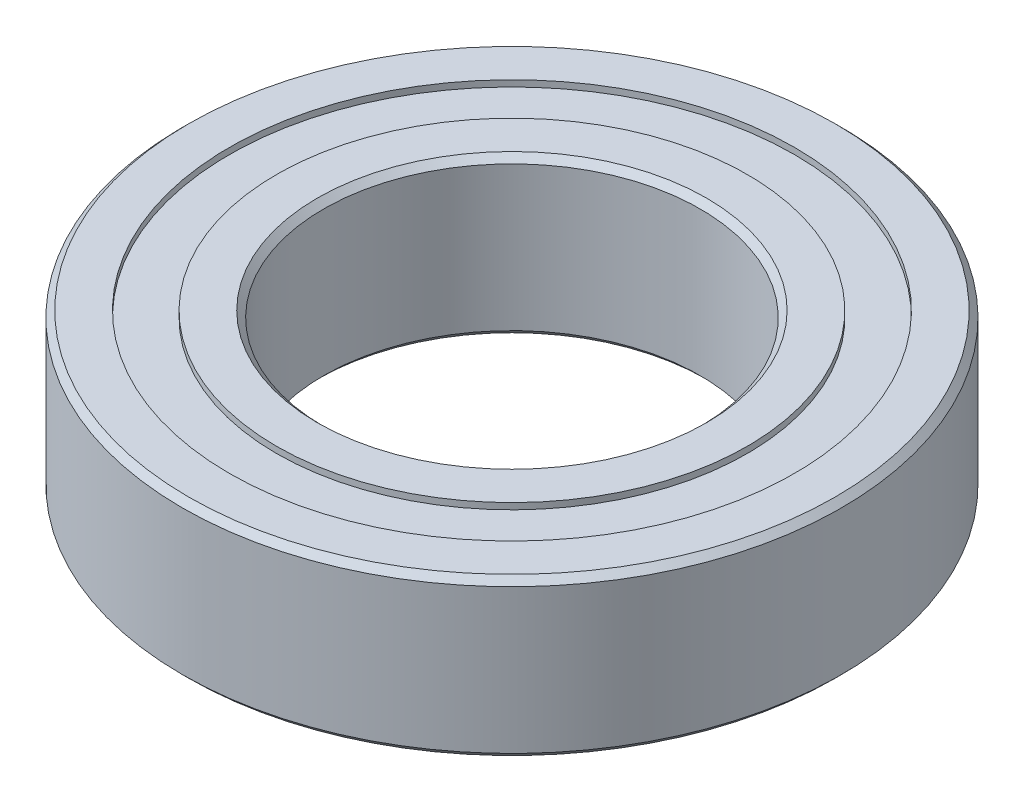
ISO-10303-21;
HEADER;
FILE_DESCRIPTION(('STEP AP214'),'2;1');
FILE_NAME('part.step','',(''),(''),'','','');
FILE_SCHEMA(('AUTOMOTIVE_DESIGN { 1 0 10303 214 1 1 1 1 }'));
ENDSEC;
DATA;
#1=APPLICATION_CONTEXT('core data for automotive mechanical design processes');
#2=APPLICATION_PROTOCOL_DEFINITION('international standard','automotive_design',2000,#1);
#3=PRODUCT_CONTEXT('',#1,'mechanical');
#4=PRODUCT('Part','Part','',(#3));
#5=PRODUCT_RELATED_PRODUCT_CATEGORY('part','',(#4));
#6=PRODUCT_DEFINITION_FORMATION('','',#4);
#7=PRODUCT_DEFINITION_CONTEXT('part definition',#1,'design');
#8=PRODUCT_DEFINITION('design','',#6,#7);
#9=PRODUCT_DEFINITION_SHAPE('','',#8);
#10=(LENGTH_UNIT() NAMED_UNIT(*) SI_UNIT(.MILLI.,.METRE.));
#11=(NAMED_UNIT(*) PLANE_ANGLE_UNIT() SI_UNIT($,.RADIAN.));
#12=(NAMED_UNIT(*) SI_UNIT($,.STERADIAN.) SOLID_ANGLE_UNIT());
#13=UNCERTAINTY_MEASURE_WITH_UNIT(LENGTH_MEASURE(1.E-05),#10,'distance_accuracy_value','');
#14=(GEOMETRIC_REPRESENTATION_CONTEXT(3) GLOBAL_UNCERTAINTY_ASSIGNED_CONTEXT((#13)) GLOBAL_UNIT_ASSIGNED_CONTEXT((#10,
#11,#12)) REPRESENTATION_CONTEXT('',''));
#15=CARTESIAN_POINT('',(0.,0.,0.));
#16=DIRECTION('',(0.,0.,1.));
#17=DIRECTION('',(1.,0.,0.));
#18=AXIS2_PLACEMENT_3D('',#15,#16,#17);
#19=CARTESIAN_POINT('',(0.,0.,0.));
#20=DIRECTION('',(0.,-1.,0.));
#21=DIRECTION('',(0.,0.,-1.));
#22=AXIS2_PLACEMENT_3D('',#19,#20,#21);
#23=CONICAL_SURFACE('',#22,6.2,0.785398163397444);
#24=CARTESIAN_POINT('',(0.,0.199999999999996,0.));
#25=DIRECTION('',(0.,-1.,0.));
#26=DIRECTION('',(0.,0.,1.));
#27=AXIS2_PLACEMENT_3D('',#24,#25,#26);
#28=CIRCLE('',#27,6.);
#29=CARTESIAN_POINT('',(0.,0.199999999999996,6.));
#30=VERTEX_POINT('',#29);
#31=EDGE_CURVE('E28',#30,#30,#28,.T.);
#32=ORIENTED_EDGE('',*,*,#31,.F.);
#33=EDGE_LOOP('',(#32));
#34=FACE_BOUND('',#33,.T.);
#35=CARTESIAN_POINT('',(0.,0.,0.));
#36=DIRECTION('',(0.,1.,0.));
#37=DIRECTION('',(0.,0.,1.));
#38=AXIS2_PLACEMENT_3D('',#35,#36,#37);
#39=CIRCLE('',#38,6.2);
#40=CARTESIAN_POINT('',(0.,0.,6.2));
#41=VERTEX_POINT('',#40);
#42=EDGE_CURVE('E54',#41,#41,#39,.T.);
#43=ORIENTED_EDGE('',*,*,#42,.F.);
#44=EDGE_LOOP('',(#43));
#45=FACE_BOUND('',#44,.T.);
#46=ADVANCED_FACE('F17',(#34,#45),#23,.F.);
#47=CARTESIAN_POINT('',(0.,4.8,0.));
#48=DIRECTION('',(0.,1.,0.));
#49=DIRECTION('',(0.,0.,1.));
#50=AXIS2_PLACEMENT_3D('',#47,#48,#49);
#51=CONICAL_SURFACE('',#50,6.,0.785398163397452);
#52=CARTESIAN_POINT('',(0.,4.8,0.));
#53=DIRECTION('',(0.,1.,0.));
#54=DIRECTION('',(0.,0.,1.));
#55=AXIS2_PLACEMENT_3D('',#52,#53,#54);
#56=CIRCLE('',#55,6.);
#57=CARTESIAN_POINT('',(0.,4.8,6.));
#58=VERTEX_POINT('',#57);
#59=EDGE_CURVE('E11',#58,#58,#56,.T.);
#60=ORIENTED_EDGE('',*,*,#59,.F.);
#61=EDGE_LOOP('',(#60));
#62=FACE_BOUND('',#61,.T.);
#63=CARTESIAN_POINT('',(0.,5.,0.));
#64=DIRECTION('',(0.,-1.,0.));
#65=DIRECTION('',(0.,0.,1.));
#66=AXIS2_PLACEMENT_3D('',#63,#64,#65);
#67=CIRCLE('',#66,6.2);
#68=CARTESIAN_POINT('',(0.,5.,6.2));
#69=VERTEX_POINT('',#68);
#70=EDGE_CURVE('E21',#69,#69,#67,.T.);
#71=ORIENTED_EDGE('',*,*,#70,.F.);
#72=EDGE_LOOP('',(#71));
#73=FACE_BOUND('',#72,.T.);
#74=ADVANCED_FACE('F167',(#62,#73),#51,.F.);
#75=CARTESIAN_POINT('',(0.,0.199999999999997,0.));
#76=DIRECTION('',(0.,1.,0.));
#77=DIRECTION('',(0.,0.,1.));
#78=AXIS2_PLACEMENT_3D('',#75,#76,#77);
#79=CONICAL_SURFACE('',#78,10.5,0.785398163397452);
#80=CARTESIAN_POINT('',(0.,0.,0.));
#81=DIRECTION('',(0.,-1.,0.));
#82=DIRECTION('',(0.,0.,1.));
#83=AXIS2_PLACEMENT_3D('',#80,#81,#82);
#84=CIRCLE('',#83,10.3);
#85=CARTESIAN_POINT('',(0.,0.,10.3));
#86=VERTEX_POINT('',#85);
#87=EDGE_CURVE('E135',#86,#86,#84,.T.);
#88=ORIENTED_EDGE('',*,*,#87,.F.);
#89=EDGE_LOOP('',(#88));
#90=FACE_BOUND('',#89,.T.);
#91=CARTESIAN_POINT('',(0.,0.199999999999997,0.));
#92=DIRECTION('',(0.,1.,0.));
#93=DIRECTION('',(0.,0.,1.));
#94=AXIS2_PLACEMENT_3D('',#91,#92,#93);
#95=CIRCLE('',#94,10.5);
#96=CARTESIAN_POINT('',(0.,0.199999999999997,10.5));
#97=VERTEX_POINT('',#96);
#98=EDGE_CURVE('E108',#97,#97,#95,.T.);
#99=ORIENTED_EDGE('',*,*,#98,.F.);
#100=EDGE_LOOP('',(#99));
#101=FACE_BOUND('',#100,.T.);
#102=ADVANCED_FACE('F169',(#90,#101),#79,.T.);
#103=CARTESIAN_POINT('',(0.,5.,0.));
#104=DIRECTION('',(0.,-1.,0.));
#105=DIRECTION('',(0.,0.,-1.));
#106=AXIS2_PLACEMENT_3D('',#103,#104,#105);
#107=CONICAL_SURFACE('',#106,10.3,0.785398163397448);
#108=CARTESIAN_POINT('',(0.,5.,0.));
#109=DIRECTION('',(0.,1.,0.));
#110=DIRECTION('',(0.,0.,1.));
#111=AXIS2_PLACEMENT_3D('',#108,#109,#110);
#112=CIRCLE('',#111,10.3);
#113=CARTESIAN_POINT('',(0.,5.,10.3));
#114=VERTEX_POINT('',#113);
#115=EDGE_CURVE('E125',#114,#114,#112,.T.);
#116=ORIENTED_EDGE('',*,*,#115,.F.);
#117=EDGE_LOOP('',(#116));
#118=FACE_BOUND('',#117,.T.);
#119=CARTESIAN_POINT('',(0.,4.8,0.));
#120=DIRECTION('',(0.,-1.,0.));
#121=DIRECTION('',(0.,0.,1.));
#122=AXIS2_PLACEMENT_3D('',#119,#120,#121);
#123=CIRCLE('',#122,10.5);
#124=CARTESIAN_POINT('',(0.,4.8,10.5));
#125=VERTEX_POINT('',#124);
#126=EDGE_CURVE('E103',#125,#125,#123,.T.);
#127=ORIENTED_EDGE('',*,*,#126,.F.);
#128=EDGE_LOOP('',(#127));
#129=FACE_BOUND('',#128,.T.);
#130=ADVANCED_FACE('F176',(#118,#129),#107,.T.);
#131=CARTESIAN_POINT('',(0.,4.8,0.));
#132=DIRECTION('',(0.,1.,0.));
#133=DIRECTION('',(0.,0.,1.));
#134=AXIS2_PLACEMENT_3D('',#131,#132,#133);
#135=CYLINDRICAL_SURFACE('',#134,7.5);
#136=CARTESIAN_POINT('',(0.,0.2,0.));
#137=DIRECTION('',(0.,-1.,0.));
#138=DIRECTION('',(0.,0.,-1.));
#139=AXIS2_PLACEMENT_3D('',#136,#137,#138);
#140=CIRCLE('',#139,7.5);
#141=CARTESIAN_POINT('',(0.,0.2,-7.5));
#142=VERTEX_POINT('',#141);
#143=EDGE_CURVE('E124',#142,#142,#140,.T.);
#144=ORIENTED_EDGE('',*,*,#143,.T.);
#145=EDGE_LOOP('',(#144));
#146=FACE_BOUND('',#145,.T.);
#147=CARTESIAN_POINT('',(0.,0.,0.));
#148=DIRECTION('',(0.,-1.,0.));
#149=DIRECTION('',(0.,0.,1.));
#150=AXIS2_PLACEMENT_3D('',#147,#148,#149);
#151=CIRCLE('',#150,7.5);
#152=CARTESIAN_POINT('',(0.,0.,7.5));
#153=VERTEX_POINT('',#152);
#154=EDGE_CURVE('E67',#153,#153,#151,.T.);
#155=ORIENTED_EDGE('',*,*,#154,.F.);
#156=EDGE_LOOP('',(#155));
#157=FACE_BOUND('',#156,.T.);
#158=ADVANCED_FACE('F191',(#146,#157),#135,.T.);
#159=CARTESIAN_POINT('',(0.,4.8,0.));
#160=DIRECTION('',(0.,1.,0.));
#161=DIRECTION('',(0.,0.,1.));
#162=AXIS2_PLACEMENT_3D('',#159,#160,#161);
#163=CYLINDRICAL_SURFACE('',#162,9.);
#164=CARTESIAN_POINT('',(0.,0.2,0.));
#165=DIRECTION('',(0.,-1.,0.));
#166=DIRECTION('',(0.,0.,-1.));
#167=AXIS2_PLACEMENT_3D('',#164,#165,#166);
#168=CIRCLE('',#167,9.);
#169=CARTESIAN_POINT('',(0.,0.2,-9.));
#170=VERTEX_POINT('',#169);
#171=EDGE_CURVE('E121',#170,#170,#168,.T.);
#172=ORIENTED_EDGE('',*,*,#171,.F.);
#173=EDGE_LOOP('',(#172));
#174=FACE_BOUND('',#173,.T.);
#175=CARTESIAN_POINT('',(0.,0.,0.));
#176=DIRECTION('',(0.,-1.,0.));
#177=DIRECTION('',(0.,0.,1.));
#178=AXIS2_PLACEMENT_3D('',#175,#176,#177);
#179=CIRCLE('',#178,9.);
#180=CARTESIAN_POINT('',(0.,0.,9.));
#181=VERTEX_POINT('',#180);
#182=EDGE_CURVE('E133',#181,#181,#179,.T.);
#183=ORIENTED_EDGE('',*,*,#182,.T.);
#184=EDGE_LOOP('',(#183));
#185=FACE_BOUND('',#184,.T.);
#186=ADVANCED_FACE('F188',(#174,#185),#163,.F.);
#187=CARTESIAN_POINT('',(0.,4.8,0.));
#188=DIRECTION('',(0.,1.,0.));
#189=DIRECTION('',(0.,0.,1.));
#190=AXIS2_PLACEMENT_3D('',#187,#188,#189);
#191=CYLINDRICAL_SURFACE('',#190,7.5);
#192=CARTESIAN_POINT('',(0.,4.8,0.));
#193=DIRECTION('',(0.,1.,0.));
#194=DIRECTION('',(0.,0.,1.));
#195=AXIS2_PLACEMENT_3D('',#192,#193,#194);
#196=CIRCLE('',#195,7.5);
#197=CARTESIAN_POINT('',(0.,4.8,7.5));
#198=VERTEX_POINT('',#197);
#199=EDGE_CURVE('E131',#198,#198,#196,.T.);
#200=ORIENTED_EDGE('',*,*,#199,.T.);
#201=EDGE_LOOP('',(#200));
#202=FACE_BOUND('',#201,.T.);
#203=CARTESIAN_POINT('',(0.,5.,0.));
#204=DIRECTION('',(0.,1.,0.));
#205=DIRECTION('',(0.,0.,1.));
#206=AXIS2_PLACEMENT_3D('',#203,#204,#205);
#207=CIRCLE('',#206,7.5);
#208=CARTESIAN_POINT('',(0.,5.,7.5));
#209=VERTEX_POINT('',#208);
#210=EDGE_CURVE('E129',#209,#209,#207,.T.);
#211=ORIENTED_EDGE('',*,*,#210,.F.);
#212=EDGE_LOOP('',(#211));
#213=FACE_BOUND('',#212,.T.);
#214=ADVANCED_FACE('F184',(#202,#213),#191,.T.);
#215=CARTESIAN_POINT('',(0.,4.8,0.));
#216=DIRECTION('',(0.,1.,0.));
#217=DIRECTION('',(0.,0.,1.));
#218=AXIS2_PLACEMENT_3D('',#215,#216,#217);
#219=CYLINDRICAL_SURFACE('',#218,9.);
#220=CARTESIAN_POINT('',(0.,4.8,0.));
#221=DIRECTION('',(0.,1.,0.));
#222=DIRECTION('',(0.,0.,1.));
#223=AXIS2_PLACEMENT_3D('',#220,#221,#222);
#224=CIRCLE('',#223,9.);
#225=CARTESIAN_POINT('',(0.,4.8,9.));
#226=VERTEX_POINT('',#225);
#227=EDGE_CURVE('E118',#226,#226,#224,.T.);
#228=ORIENTED_EDGE('',*,*,#227,.F.);
#229=EDGE_LOOP('',(#228));
#230=FACE_BOUND('',#229,.T.);
#231=CARTESIAN_POINT('',(0.,5.,0.));
#232=DIRECTION('',(0.,1.,0.));
#233=DIRECTION('',(0.,0.,1.));
#234=AXIS2_PLACEMENT_3D('',#231,#232,#233);
#235=CIRCLE('',#234,9.);
#236=CARTESIAN_POINT('',(0.,5.,9.));
#237=VERTEX_POINT('',#236);
#238=EDGE_CURVE('E130',#237,#237,#235,.T.);
#239=ORIENTED_EDGE('',*,*,#238,.T.);
#240=EDGE_LOOP('',(#239));
#241=FACE_BOUND('',#240,.T.);
#242=ADVANCED_FACE('F187',(#230,#241),#219,.F.);
#243=CARTESIAN_POINT('',(0.,5.,0.));
#244=DIRECTION('',(0.,-1.,0.));
#245=DIRECTION('',(0.,0.,-1.));
#246=AXIS2_PLACEMENT_3D('',#243,#244,#245);
#247=CYLINDRICAL_SURFACE('',#246,6.);
#248=ORIENTED_EDGE('',*,*,#59,.T.);
#249=EDGE_LOOP('',(#248));
#250=FACE_BOUND('',#249,.T.);
#251=ORIENTED_EDGE('',*,*,#31,.T.);
#252=EDGE_LOOP('',(#251));
#253=FACE_BOUND('',#252,.T.);
#254=ADVANCED_FACE('F194',(#250,#253),#247,.F.);
#255=CARTESIAN_POINT('',(0.,5.,0.));
#256=DIRECTION('',(0.,-1.,0.));
#257=DIRECTION('',(0.,0.,-1.));
#258=AXIS2_PLACEMENT_3D('',#255,#256,#257);
#259=CYLINDRICAL_SURFACE('',#258,10.5);
#260=ORIENTED_EDGE('',*,*,#126,.T.);
#261=EDGE_LOOP('',(#260));
#262=FACE_BOUND('',#261,.T.);
#263=ORIENTED_EDGE('',*,*,#98,.T.);
#264=EDGE_LOOP('',(#263));
#265=FACE_BOUND('',#264,.T.);
#266=ADVANCED_FACE('F104',(#262,#265),#259,.T.);
#267=CARTESIAN_POINT('',(0.,0.,0.));
#268=DIRECTION('',(0.,1.,0.));
#269=DIRECTION('',(1.,0.,0.));
#270=AXIS2_PLACEMENT_3D('',#267,#268,#269);
#271=PLANE('',#270);
#272=ORIENTED_EDGE('',*,*,#42,.T.);
#273=EDGE_LOOP('',(#272));
#274=FACE_BOUND('',#273,.T.);
#275=ORIENTED_EDGE('',*,*,#154,.T.);
#276=EDGE_LOOP('',(#275));
#277=FACE_BOUND('',#276,.T.);
#278=ADVANCED_FACE('F19',(#274,#277),#271,.F.);
#279=CARTESIAN_POINT('',(0.,5.,0.));
#280=DIRECTION('',(0.,1.,0.));
#281=DIRECTION('',(1.,0.,0.));
#282=AXIS2_PLACEMENT_3D('',#279,#280,#281);
#283=PLANE('',#282);
#284=ORIENTED_EDGE('',*,*,#70,.T.);
#285=EDGE_LOOP('',(#284));
#286=FACE_BOUND('',#285,.T.);
#287=ORIENTED_EDGE('',*,*,#210,.T.);
#288=EDGE_LOOP('',(#287));
#289=FACE_BOUND('',#288,.T.);
#290=ADVANCED_FACE('F165',(#286,#289),#283,.T.);
#291=CARTESIAN_POINT('',(0.,5.,0.));
#292=DIRECTION('',(0.,1.,0.));
#293=DIRECTION('',(1.,0.,0.));
#294=AXIS2_PLACEMENT_3D('',#291,#292,#293);
#295=PLANE('',#294);
#296=ORIENTED_EDGE('',*,*,#115,.T.);
#297=EDGE_LOOP('',(#296));
#298=FACE_BOUND('',#297,.T.);
#299=ORIENTED_EDGE('',*,*,#238,.F.);
#300=EDGE_LOOP('',(#299));
#301=FACE_BOUND('',#300,.T.);
#302=ADVANCED_FACE('F257',(#298,#301),#295,.T.);
#303=CARTESIAN_POINT('',(0.,0.,0.));
#304=DIRECTION('',(0.,1.,0.));
#305=DIRECTION('',(1.,0.,0.));
#306=AXIS2_PLACEMENT_3D('',#303,#304,#305);
#307=PLANE('',#306);
#308=ORIENTED_EDGE('',*,*,#87,.T.);
#309=EDGE_LOOP('',(#308));
#310=FACE_BOUND('',#309,.T.);
#311=ORIENTED_EDGE('',*,*,#182,.F.);
#312=EDGE_LOOP('',(#311));
#313=FACE_BOUND('',#312,.T.);
#314=ADVANCED_FACE('F245',(#310,#313),#307,.F.);
#315=CARTESIAN_POINT('',(0.,4.8,0.));
#316=DIRECTION('',(0.,1.,0.));
#317=DIRECTION('',(1.,0.,0.));
#318=AXIS2_PLACEMENT_3D('',#315,#316,#317);
#319=PLANE('',#318);
#320=ORIENTED_EDGE('',*,*,#199,.F.);
#321=EDGE_LOOP('',(#320));
#322=FACE_BOUND('',#321,.T.);
#323=ORIENTED_EDGE('',*,*,#227,.T.);
#324=EDGE_LOOP('',(#323));
#325=FACE_BOUND('',#324,.T.);
#326=ADVANCED_FACE('F232',(#322,#325),#319,.T.);
#327=CARTESIAN_POINT('',(0.,0.2,0.));
#328=DIRECTION('',(0.,-1.,0.));
#329=DIRECTION('',(0.,0.,-1.));
#330=AXIS2_PLACEMENT_3D('',#327,#328,#329);
#331=PLANE('',#330);
#332=ORIENTED_EDGE('',*,*,#143,.F.);
#333=EDGE_LOOP('',(#332));
#334=FACE_BOUND('',#333,.T.);
#335=ORIENTED_EDGE('',*,*,#171,.T.);
#336=EDGE_LOOP('',(#335));
#337=FACE_BOUND('',#336,.T.);
#338=ADVANCED_FACE('F226',(#334,#337),#331,.T.);
#339=CLOSED_SHELL('',(#46,#74,#102,#130,#158,#186,#214,#242,#254,#266,#278,#290,#302,#314,#326,#338));
#340=MANIFOLD_SOLID_BREP('B1',#339);
#341=ADVANCED_BREP_SHAPE_REPRESENTATION('',(#18,#340),#14);
#342=SHAPE_DEFINITION_REPRESENTATION(#9,#341);
ENDSEC;
END-ISO-10303-21;
